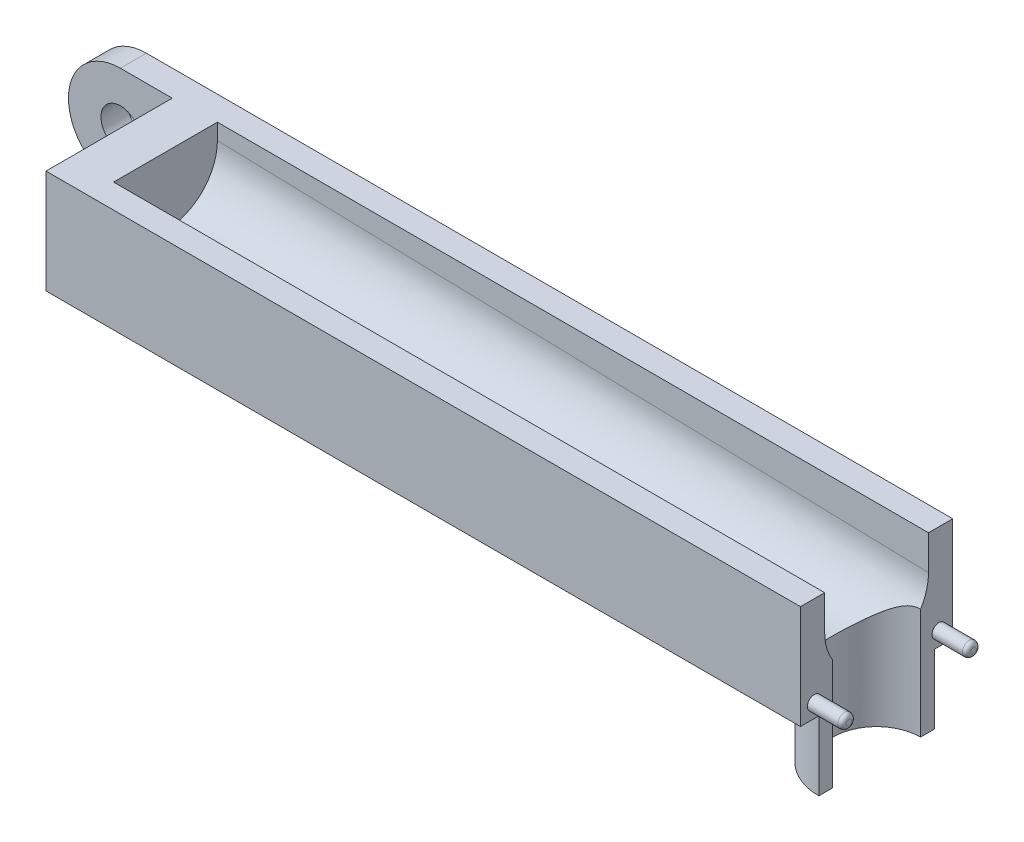
ISO-10303-21;
HEADER;
FILE_DESCRIPTION(('STEP AP214'),'2;1');
FILE_NAME('part.step','',(''),(''),'','','');
FILE_SCHEMA(('AUTOMOTIVE_DESIGN { 1 0 10303 214 1 1 1 1 }'));
ENDSEC;
DATA;
#1=APPLICATION_CONTEXT('core data for automotive mechanical design processes');
#2=APPLICATION_PROTOCOL_DEFINITION('international standard','automotive_design',2000,#1);
#3=PRODUCT_CONTEXT('',#1,'mechanical');
#4=PRODUCT('Part','Part','',(#3));
#5=PRODUCT_RELATED_PRODUCT_CATEGORY('part','',(#4));
#6=PRODUCT_DEFINITION_FORMATION('','',#4);
#7=PRODUCT_DEFINITION_CONTEXT('part definition',#1,'design');
#8=PRODUCT_DEFINITION('design','',#6,#7);
#9=PRODUCT_DEFINITION_SHAPE('','',#8);
#10=(LENGTH_UNIT() NAMED_UNIT(*) SI_UNIT(.MILLI.,.METRE.));
#11=(NAMED_UNIT(*) PLANE_ANGLE_UNIT() SI_UNIT($,.RADIAN.));
#12=(NAMED_UNIT(*) SI_UNIT($,.STERADIAN.) SOLID_ANGLE_UNIT());
#13=UNCERTAINTY_MEASURE_WITH_UNIT(LENGTH_MEASURE(1.E-05),#10,'distance_accuracy_value','');
#14=(GEOMETRIC_REPRESENTATION_CONTEXT(3) GLOBAL_UNCERTAINTY_ASSIGNED_CONTEXT((#13)) GLOBAL_UNIT_ASSIGNED_CONTEXT((#10,
#11,#12)) REPRESENTATION_CONTEXT('',''));
#15=CARTESIAN_POINT('',(0.,0.,0.));
#16=DIRECTION('',(0.,0.,1.));
#17=DIRECTION('',(1.,0.,0.));
#18=AXIS2_PLACEMENT_3D('',#15,#16,#17);
#19=CARTESIAN_POINT('',(138.4173,-22.225,0.));
#20=DIRECTION('',(0.,-1.,0.));
#21=DIRECTION('',(0.,0.,-1.));
#22=AXIS2_PLACEMENT_3D('',#19,#20,#21);
#23=PLANE('',#22);
#24=CARTESIAN_POINT('',(138.4173,-22.225,0.));
#25=DIRECTION('',(0.,-1.,0.));
#26=DIRECTION('',(0.,0.,-1.));
#27=AXIS2_PLACEMENT_3D('',#24,#25,#26);
#28=CIRCLE('',#27,10.6045);
#29=CARTESIAN_POINT('',(138.4173,-22.225,10.6045));
#30=VERTEX_POINT('',#29);
#31=CARTESIAN_POINT('',(138.4173,-22.225,-10.6045));
#32=VERTEX_POINT('',#31);
#33=EDGE_CURVE('E143',#30,#32,#28,.T.);
#34=ORIENTED_EDGE('',*,*,#33,.T.);
#35=DIRECTION('',(0.,0.,-1.));
#36=VECTOR('',#35,1.);
#37=CARTESIAN_POINT('',(138.4173,-22.225,13.97));
#38=LINE('',#37,#36);
#39=CARTESIAN_POINT('',(138.4173,-22.225,-8.0645));
#40=VERTEX_POINT('',#39);
#41=EDGE_CURVE('E530',#40,#32,#38,.T.);
#42=ORIENTED_EDGE('',*,*,#41,.F.);
#43=CARTESIAN_POINT('',(138.4173,-22.225,0.));
#44=DIRECTION('',(0.,-1.,0.));
#45=DIRECTION('',(0.,0.,-1.));
#46=AXIS2_PLACEMENT_3D('',#43,#44,#45);
#47=CIRCLE('',#46,8.0645);
#48=CARTESIAN_POINT('',(138.4173,-22.225,8.0645));
#49=VERTEX_POINT('',#48);
#50=EDGE_CURVE('E531',#49,#40,#47,.T.);
#51=ORIENTED_EDGE('',*,*,#50,.F.);
#52=EDGE_CURVE('E148',#30,#49,#38,.T.);
#53=ORIENTED_EDGE('',*,*,#52,.F.);
#54=EDGE_LOOP('',(#34,#42,#51,#53));
#55=FACE_BOUND('',#54,.T.);
#56=ADVANCED_FACE('F33',(#55),#23,.T.);
#57=CARTESIAN_POINT('',(138.4173,-22.225,0.));
#58=DIRECTION('',(0.,1.,0.));
#59=DIRECTION('',(0.,0.,1.));
#60=AXIS2_PLACEMENT_3D('',#57,#58,#59);
#61=CYLINDRICAL_SURFACE('',#60,10.6045);
#62=DIRECTION('',(0.,1.,0.));
#63=VECTOR('',#62,1.);
#64=CARTESIAN_POINT('',(138.4173,-22.225,-10.6045));
#65=LINE('',#64,#63);
#66=CARTESIAN_POINT('',(138.4173,-9.525,-10.6045));
#67=VERTEX_POINT('',#66);
#68=EDGE_CURVE('E147',#32,#67,#65,.T.);
#69=ORIENTED_EDGE('',*,*,#68,.F.);
#70=ORIENTED_EDGE('',*,*,#33,.F.);
#71=DIRECTION('',(0.,1.,0.));
#72=VECTOR('',#71,1.);
#73=CARTESIAN_POINT('',(138.4173,-22.225,10.6045));
#74=LINE('',#73,#72);
#75=CARTESIAN_POINT('',(138.4173,-9.525,10.6045));
#76=VERTEX_POINT('',#75);
#77=EDGE_CURVE('E136',#76,#30,#74,.F.);
#78=ORIENTED_EDGE('',*,*,#77,.F.);
#79=CARTESIAN_POINT('',(138.4173,-9.525,0.));
#80=DIRECTION('',(0.,1.,0.));
#81=DIRECTION('',(0.,0.,1.));
#82=AXIS2_PLACEMENT_3D('',#79,#80,#81);
#83=CIRCLE('',#82,10.6045);
#84=EDGE_CURVE('E140',#76,#67,#83,.F.);
#85=ORIENTED_EDGE('',*,*,#84,.T.);
#86=EDGE_LOOP('',(#69,#70,#78,#85));
#87=FACE_BOUND('',#86,.T.);
#88=ADVANCED_FACE('F139',(#87),#61,.T.);
#89=CARTESIAN_POINT('',(138.4173,-22.225,0.));
#90=DIRECTION('',(0.,1.,0.));
#91=DIRECTION('',(0.,0.,1.));
#92=AXIS2_PLACEMENT_3D('',#89,#90,#91);
#93=CYLINDRICAL_SURFACE('',#92,8.0645);
#94=ORIENTED_EDGE('',*,*,#50,.T.);
#95=DIRECTION('',(0.,-1.,0.));
#96=VECTOR('',#95,1.);
#97=CARTESIAN_POINT('',(138.4173,9.52500000000009,-8.0645));
#98=LINE('',#97,#96);
#99=CARTESIAN_POINT('',(138.4173,-1.893477557413,-8.0645));
#100=VERTEX_POINT('',#99);
#101=EDGE_CURVE('E528',#100,#40,#98,.T.);
#102=ORIENTED_EDGE('',*,*,#101,.F.);
#103=CARTESIAN_POINT('',(138.4173,-1.893477557413,-8.0645));
#104=CARTESIAN_POINT('',(138.348261490488,-1.89166509618479,-8.06450122168329));
#105=CARTESIAN_POINT('',(138.279196595506,-1.89127251769599,-8.06361317446126));
#106=CARTESIAN_POINT('',(138.141162024241,-1.89329565352478,-8.06006646387264));
#107=CARTESIAN_POINT('',(138.072192336974,-1.89571101096955,-8.05740802553111));
#108=CARTESIAN_POINT('',(137.865913059656,-1.90710555009781,-8.0468036435229));
#109=CARTESIAN_POINT('',(137.728939948282,-1.92022582089757,-8.03622855618554));
#110=CARTESIAN_POINT('',(137.459177777007,-1.95645794545555,-8.00851328840444));
#111=CARTESIAN_POINT('',(137.32635676714,-1.97941541652284,-7.99147499555421));
#112=CARTESIAN_POINT('',(137.063465765685,-2.03416363113122,-7.95116293380551));
#113=CARTESIAN_POINT('',(136.933397285699,-2.06595909935292,-7.92788582995689));
#114=CARTESIAN_POINT('',(136.626022893416,-2.15108622448129,-7.86516632289012));
#115=CARTESIAN_POINT('',(136.450263093756,-2.2079694724281,-7.82296691720035));
#116=CARTESIAN_POINT('',(136.105692865908,-2.33292870638938,-7.72816957525117));
#117=CARTESIAN_POINT('',(135.936885373241,-2.40100936098795,-7.67556729981786));
#118=CARTESIAN_POINT('',(135.604907729987,-2.54593743104196,-7.56027327808437));
#119=CARTESIAN_POINT('',(135.441793740416,-2.62285086131409,-7.49750389598407));
#120=CARTESIAN_POINT('',(135.12242610643,-2.78249733398254,-7.36274420877662));
#121=CARTESIAN_POINT('',(134.966172316025,-2.86523025243831,-7.2907541000211));
#122=CARTESIAN_POINT('',(134.584323283596,-3.07650217578338,-7.0999959261609));
#123=CARTESIAN_POINT('',(134.362766898589,-3.20741106738572,-6.97573420703643));
#124=CARTESIAN_POINT('',(133.933660185702,-3.47262194048077,-6.70798766444703));
#125=CARTESIAN_POINT('',(133.726116392696,-3.60692546550414,-6.56449396386022));
#126=CARTESIAN_POINT('',(133.325490062638,-3.87465214318861,-6.25883160393269));
#127=CARTESIAN_POINT('',(133.132379361802,-4.00807652117544,-6.09670096938882));
#128=CARTESIAN_POINT('',(132.760800457386,-4.27092552604784,-5.75361402433204));
#129=CARTESIAN_POINT('',(132.58232689971,-4.40035160456889,-5.57266465292213));
#130=CARTESIAN_POINT('',(132.273968015489,-4.62793211377197,-5.22859780206963));
#131=CARTESIAN_POINT('',(132.141339635497,-4.72731340914288,-5.0687442755236));
#132=CARTESIAN_POINT('',(131.887250228059,-4.91988610027664,-4.73690437159381));
#133=CARTESIAN_POINT('',(131.765787033657,-5.01307869617194,-4.56492036001078));
#134=CARTESIAN_POINT('',(131.535214878537,-5.19158642366717,-4.20926700130387));
#135=CARTESIAN_POINT('',(131.426093123044,-5.27690969639455,-4.02561007032792));
#136=CARTESIAN_POINT('',(131.221333341849,-5.43814973997114,-3.64698714927302));
#137=CARTESIAN_POINT('',(131.125692758164,-5.51406829498509,-3.4520233145569));
#138=CARTESIAN_POINT('',(130.964862601421,-5.64243125130164,-3.08703460838471));
#139=CARTESIAN_POINT('',(130.897278275298,-5.69665337438041,-2.91868726705674));
#140=CARTESIAN_POINT('',(130.772983200507,-5.79673201350475,-2.57562598660811));
#141=CARTESIAN_POINT('',(130.716270226371,-5.84259024162485,-2.40091335925491));
#142=CARTESIAN_POINT('',(130.614491170541,-5.92511149714523,-2.04606646711942));
#143=CARTESIAN_POINT('',(130.569420809245,-5.96177790313741,-1.86593422174664));
#144=CARTESIAN_POINT('',(130.491582694961,-6.02522141376103,-1.50130419983232));
#145=CARTESIAN_POINT('',(130.458815087334,-6.05199840154719,-1.31680637173804));
#146=CARTESIAN_POINT('',(130.406009733957,-6.09519772885091,-0.943928558818516));
#147=CARTESIAN_POINT('',(130.386030089257,-6.11157280564797,-0.755534814275804));
#148=CARTESIAN_POINT('',(130.359392987414,-6.13341220472642,-0.377172972319024));
#149=CARTESIAN_POINT('',(130.352735558872,-6.13887650358291,-0.187204871525768));
#150=CARTESIAN_POINT('',(130.352865381074,-6.13876999621962,0.192711301271527));
#151=CARTESIAN_POINT('',(130.359651829911,-6.13319984818903,0.382659373794362));
#152=CARTESIAN_POINT('',(130.386543380214,-6.11115210426788,0.760963080205654));
#153=CARTESIAN_POINT('',(130.40664794813,-6.09467494533483,0.949318777581825));
#154=CARTESIAN_POINT('',(130.457892687727,-6.05275364057798,1.30944831815795));
#155=CARTESIAN_POINT('',(130.488131469125,-6.02804265568402,1.48143764186625));
#156=CARTESIAN_POINT('',(130.559335576371,-5.96999125695433,1.82175385735741));
#157=CARTESIAN_POINT('',(130.600304548019,-5.93664791014314,1.99007948323005));
#158=CARTESIAN_POINT('',(130.692404127251,-5.86191819984588,2.32202615685273));
#159=CARTESIAN_POINT('',(130.743531446832,-5.82053443893766,2.48564870730684));
#160=CARTESIAN_POINT('',(130.855361887216,-5.73035745355051,2.80754346738453));
#161=CARTESIAN_POINT('',(130.916068572507,-5.68156147123286,2.96581365866535));
#162=CARTESIAN_POINT('',(131.05137388664,-5.57330025208726,3.28817954802761));
#163=CARTESIAN_POINT('',(131.126678273876,-5.51330557056704,3.45180141516908));
#164=CARTESIAN_POINT('',(131.286841800602,-5.38647011030597,3.7715700142372));
#165=CARTESIAN_POINT('',(131.371704732337,-5.31962661533156,3.92771374403385));
#166=CARTESIAN_POINT('',(131.639575365112,-5.11013483865318,4.38441817598845));
#167=CARTESIAN_POINT('',(131.835872026216,-4.95851950575256,4.6732688246686));
#168=CARTESIAN_POINT('',(132.201975608306,-4.68162613209482,5.14488364737323));
#169=CARTESIAN_POINT('',(132.364886989127,-4.56010676458918,5.33539669109072));
#170=CARTESIAN_POINT('',(132.705526988799,-4.31096889517377,5.69857667349938));
#171=CARTESIAN_POINT('',(132.883262190731,-4.1833476943639,5.87123560633565));
#172=CARTESIAN_POINT('',(133.252797351224,-3.92477198644624,6.19880471589004));
#173=CARTESIAN_POINT('',(133.444621334858,-3.79381204632814,6.3536833634987));
#174=CARTESIAN_POINT('',(133.841593382331,-3.5320126679356,6.64527734464367));
#175=CARTESIAN_POINT('',(134.04673682759,-3.4011732036779,6.78199892466878));
#176=CARTESIAN_POINT('',(134.41625779171,-3.17646562337186,7.00440307457374));
#177=CARTESIAN_POINT('',(134.577633805191,-3.08170440901505,7.09419342111636));
#178=CARTESIAN_POINT('',(134.908134913249,-2.89637005243713,7.26335928802849));
#179=CARTESIAN_POINT('',(135.077260711223,-2.80579729187899,7.34273386049143));
#180=CARTESIAN_POINT('',(135.423204055421,-2.63154330594256,7.49045096194537));
#181=CARTESIAN_POINT('',(135.600004467886,-2.54784782564135,7.55881660749617));
#182=CARTESIAN_POINT('',(135.961896226059,-2.39033290404474,7.6839942574546));
#183=CARTESIAN_POINT('',(136.146982982171,-2.31650808380714,7.74081256334983));
#184=CARTESIAN_POINT('',(136.462243431721,-2.20502345304227,7.82501973818367));
#185=CARTESIAN_POINT('',(136.590127439358,-2.16351690158071,7.85590170918726));
#186=CARTESIAN_POINT('',(136.849340267443,-2.08798451641423,7.91171439852365));
#187=CARTESIAN_POINT('',(136.980667770462,-2.05395586719925,7.93664735702748));
#188=CARTESIAN_POINT('',(137.245946218365,-1.99481662107536,7.98010639963252));
#189=CARTESIAN_POINT('',(137.379887892735,-1.96967902030762,7.99865187918271));
#190=CARTESIAN_POINT('',(137.649971359256,-1.9294182406905,8.02906011789665));
#191=CARTESIAN_POINT('',(137.786111653927,-1.91428851763418,8.0409272433141));
#192=CARTESIAN_POINT('',(138.004952138709,-1.89876764558756,8.05437190776033));
#193=CARTESIAN_POINT('',(138.08728657725,-1.89490376525848,8.05816595054862));
#194=CARTESIAN_POINT('',(138.252193683452,-1.8911705548865,8.06323279365226));
#195=CARTESIAN_POINT('',(138.334766495048,-1.891304661052,8.06450342413288));
#196=CARTESIAN_POINT('',(138.4173,-1.89347755741299,8.0645));
#197=B_SPLINE_CURVE_WITH_KNOTS('',3,(#103,#104,#105,#106,#107,#108,#109,#110,#111,#112,#113,
#114,#115,#116,#117,#118,#119,#120,#121,#122,#123,#124,#125,#126,#127,#128,#129,#130,#131,#132,
#133,#134,#135,#136,#137,#138,#139,#140,#141,#142,#143,#144,#145,#146,#147,#148,#149,#150,#151,
#152,#153,#154,#155,#156,#157,#158,#159,#160,#161,#162,#163,#164,#165,#166,#167,#168,#169,#170,
#171,#172,#173,#174,#175,#176,#177,#178,#179,#180,#181,#182,#183,#184,#185,#186,#187,#188,#189,
#190,#191,#192,#193,#194,#195,#196),.UNSPECIFIED.,.F.,.F.,(4,2,2,2,2,2,2,2,2,2,2,2,2,2,2,2,2,2,
2,2,2,2,2,2,2,2,2,2,2,2,2,2,2,2,2,2,2,2,2,2,2,2,2,2,2,2,4),(0.,0.207145597104745,
0.414264870049337,0.827626898952442,1.23472654039575,1.6420442320615,2.20959669323147,
2.77738638921491,3.34973600096062,3.92207342677992,4.77823197408041,5.63478707792631,
6.48962458160509,7.34414798798741,8.03431936533694,8.72435650922381,9.41367158114747,
10.1028556825049,10.6703094014833,11.2376468329997,11.804775424375,12.371910716264,
12.9416047843827,13.5113000756056,14.0809613863306,14.6505998766212,15.1791179142763,
15.7078157601312,16.2363427575979,16.7650668860718,17.3340435941869,17.9032468379116,
19.0415966815331,19.8763778740696,20.7115317773138,21.5481444703431,22.3844685977917,
23.0067809436093,23.6291498848802,24.2501944361117,24.8708991622746,25.2844411517819,
25.6978271705231,26.1099466499332,26.5217963750139,26.769208586411,27.0168334509554),.UNSPECIFIED.);
#198=CARTESIAN_POINT('',(138.4173,-1.89347755741299,8.0645));
#199=VERTEX_POINT('',#198);
#200=EDGE_CURVE('E269',#100,#199,#197,.T.);
#201=ORIENTED_EDGE('',*,*,#200,.T.);
#202=DIRECTION('',(0.,-1.,0.));
#203=VECTOR('',#202,1.);
#204=CARTESIAN_POINT('',(138.4173,9.52500000000009,8.0645));
#205=LINE('',#204,#203);
#206=EDGE_CURVE('E48',#49,#199,#205,.F.);
#207=ORIENTED_EDGE('',*,*,#206,.F.);
#208=EDGE_LOOP('',(#94,#102,#201,#207));
#209=FACE_BOUND('',#208,.T.);
#210=ADVANCED_FACE('F217',(#209),#93,.F.);
#211=CARTESIAN_POINT('',(138.4173,0.,0.));
#212=DIRECTION('',(-1.,0.,0.));
#213=DIRECTION('',(0.,0.,1.));
#214=AXIS2_PLACEMENT_3D('',#211,#212,#213);
#215=PLANE('',#214);
#216=CARTESIAN_POINT('',(138.4173,-6.985,-11.43));
#217=DIRECTION('',(-1.,0.,0.));
#218=DIRECTION('',(0.,0.,1.));
#219=AXIS2_PLACEMENT_3D('',#216,#217,#218);
#220=CIRCLE('',#219,1.27);
#221=CARTESIAN_POINT('',(138.4173,-6.985,-10.16));
#222=VERTEX_POINT('',#221);
#223=EDGE_CURVE('E189',#222,#222,#220,.F.);
#224=ORIENTED_EDGE('',*,*,#223,.F.);
#225=EDGE_LOOP('',(#224));
#226=FACE_BOUND('',#225,.T.);
#227=CARTESIAN_POINT('',(138.4173,3.17500000000009,-9.525));
#228=CARTESIAN_POINT('',(138.4173,2.90710636951569,-9.52502880308579));
#229=CARTESIAN_POINT('',(138.4173,2.63921688214058,-9.5136993193376));
#230=CARTESIAN_POINT('',(138.4173,2.10535446999233,-9.46853181588204));
#231=CARTESIAN_POINT('',(138.4173,1.83938145406681,-9.43469487392717));
#232=CARTESIAN_POINT('',(138.4173,1.31141986681751,-9.34475207723556));
#233=CARTESIAN_POINT('',(138.4173,1.04942862616524,-9.28866189247582));
#234=CARTESIAN_POINT('',(138.4173,0.531103084706367,-9.15462068517997));
#235=CARTESIAN_POINT('',(138.4173,0.274768715199605,-9.07666992828848));
#236=CARTESIAN_POINT('',(138.4173,-0.230541539428631,-8.89941777473788));
#237=CARTESIAN_POINT('',(138.4173,-0.479513981745249,-8.80010656301914));
#238=CARTESIAN_POINT('',(138.4173,-0.96821199674888,-8.58085916286381));
#239=CARTESIAN_POINT('',(138.4173,-1.20793737117213,-8.46092253250404));
#240=CARTESIAN_POINT('',(138.4173,-1.67638284749587,-8.2013051127429));
#241=CARTESIAN_POINT('',(138.4173,-1.90510519690559,-8.06162837866167));
#242=CARTESIAN_POINT('',(138.4173,-2.34997044894806,-7.7635057612349));
#243=CARTESIAN_POINT('',(138.4173,-2.56611340884637,-7.6050599633423));
#244=CARTESIAN_POINT('',(138.4173,-2.98429198445746,-7.27051906656807));
#245=CARTESIAN_POINT('',(138.4173,-3.18632710630337,-7.09442335034852));
#246=CARTESIAN_POINT('',(138.4173,-3.57484139426011,-6.72584294773196));
#247=CARTESIAN_POINT('',(138.4173,-3.76132089085019,-6.53335860968686));
#248=CARTESIAN_POINT('',(138.4173,-4.11743232508971,-6.13333322053391));
#249=CARTESIAN_POINT('',(138.4173,-4.2870615046551,-5.9257897141086));
#250=CARTESIAN_POINT('',(138.4173,-4.60823143453897,-5.49714962732861));
#251=CARTESIAN_POINT('',(138.4173,-4.75977219291506,-5.27605305301128));
#252=CARTESIAN_POINT('',(138.4173,-5.04368159450875,-4.82188885302562));
#253=CARTESIAN_POINT('',(138.4173,-5.17605108156056,-4.58882175485864));
#254=CARTESIAN_POINT('',(138.4173,-5.42068476516995,-4.11236460914558));
#255=CARTESIAN_POINT('',(138.4173,-5.53294896060468,-3.86897456102299));
#256=CARTESIAN_POINT('',(138.4173,-5.7365673365378,-3.37361789299633));
#257=CARTESIAN_POINT('',(138.4173,-5.82792285664935,-3.12165182374448));
#258=CARTESIAN_POINT('',(138.4173,-5.98908364968767,-2.61091955380518));
#259=CARTESIAN_POINT('',(138.4173,-6.05888892412982,-2.3521533535959));
#260=CARTESIAN_POINT('',(138.4173,-6.17645419778953,-1.82965499214984));
#261=CARTESIAN_POINT('',(138.4173,-6.22421374425433,-1.56592272904088));
#262=CARTESIAN_POINT('',(138.4173,-6.29734591601616,-1.03537233089459));
#263=CARTESIAN_POINT('',(138.4173,-6.32271854007901,-0.76855419568715));
#264=CARTESIAN_POINT('',(138.4173,-6.3508968068655,-0.233722777773009));
#265=CARTESIAN_POINT('',(138.4173,-6.35370193022794,0.0342905322970394));
#266=CARTESIAN_POINT('',(138.4173,-6.33672388793071,0.569600735391586));
#267=CARTESIAN_POINT('',(138.4173,-6.31694072225219,0.836897628415487));
#268=CARTESIAN_POINT('',(138.4173,-6.25492706052983,1.36887199031537));
#269=CARTESIAN_POINT('',(138.4173,-6.21269678737656,1.63354948517432));
#270=CARTESIAN_POINT('',(138.4173,-6.10608928151298,2.15840604120375));
#271=CARTESIAN_POINT('',(138.4173,-6.04171204891415,2.41858510239688));
#272=CARTESIAN_POINT('',(138.4173,-5.89126854645122,2.93259425821957));
#273=CARTESIAN_POINT('',(138.4173,-5.80520234490116,3.18642437284373));
#274=CARTESIAN_POINT('',(138.4173,-5.61199268640836,3.68593189843645));
#275=CARTESIAN_POINT('',(138.4173,-5.50484923055732,3.93160930982728));
#276=CARTESIAN_POINT('',(138.4173,-5.27024493227508,4.41306862968216));
#277=CARTESIAN_POINT('',(138.4173,-5.14278376923979,4.64885038192307));
#278=CARTESIAN_POINT('',(138.4173,-4.86844857714667,5.10884279359658));
#279=CARTESIAN_POINT('',(138.4173,-4.72157414041553,5.33305320989682));
#280=CARTESIAN_POINT('',(138.4173,-4.40946793786088,5.76829068041108));
#281=CARTESIAN_POINT('',(138.4173,-4.24423725362736,5.97931851022826));
#282=CARTESIAN_POINT('',(138.4173,-3.89658647370972,6.3867046056825));
#283=CARTESIAN_POINT('',(138.4173,-3.71416641049008,6.58306289902373));
#284=CARTESIAN_POINT('',(138.4173,-3.33345892458108,6.95968923569139));
#285=CARTESIAN_POINT('',(138.4173,-3.13517362651337,7.13995942666822));
#286=CARTESIAN_POINT('',(138.4173,-2.72412365795625,7.48315788187575));
#287=CARTESIAN_POINT('',(138.4173,-2.51135898460188,7.64608614267509));
#288=CARTESIAN_POINT('',(138.4173,-2.07278924351203,7.95349406108793));
#289=CARTESIAN_POINT('',(138.4173,-1.8469798491703,8.09796754610229));
#290=CARTESIAN_POINT('',(138.4173,-1.38399811433214,8.36737063028996));
#291=CARTESIAN_POINT('',(138.4173,-1.14682612033463,8.49230082493489));
#292=CARTESIAN_POINT('',(138.4173,-0.662645561547024,8.72180739776883));
#293=CARTESIAN_POINT('',(138.4173,-0.415630821013257,8.82637074679174));
#294=CARTESIAN_POINT('',(138.4173,0.0863298593561496,9.01429736468387));
#295=CARTESIAN_POINT('',(138.4173,0.341275584258725,9.09766120750801));
#296=CARTESIAN_POINT('',(138.4173,0.856950944211646,9.24250591805611));
#297=CARTESIAN_POINT('',(138.4173,1.11767278306814,9.30401457551381));
#298=CARTESIAN_POINT('',(138.4173,1.64326629049545,9.40483738558105));
#299=CARTESIAN_POINT('',(138.4173,1.90813585620842,9.44416243310338));
#300=CARTESIAN_POINT('',(138.4173,2.34048489351578,9.48984743799971));
#301=CARTESIAN_POINT('',(138.4173,2.50727229378025,9.50303805093001));
#302=CARTESIAN_POINT('',(138.4173,2.84103400798305,9.52060801901113));
#303=CARTESIAN_POINT('',(138.4173,3.00800755710718,9.52500190448859));
#304=CARTESIAN_POINT('',(138.4173,3.17500000000009,9.525));
#305=B_SPLINE_CURVE_WITH_KNOTS('',3,(#227,#228,#229,#230,#231,#232,#233,#234,#235,#236,#237,
#238,#239,#240,#241,#242,#243,#244,#245,#246,#247,#248,#249,#250,#251,#252,#253,#254,#255,#256,
#257,#258,#259,#260,#261,#262,#263,#264,#265,#266,#267,#268,#269,#270,#271,#272,#273,#274,#275,
#276,#277,#278,#279,#280,#281,#282,#283,#284,#285,#286,#287,#288,#289,#290,#291,#292,#293,#294,
#295,#296,#297,#298,#299,#300,#301,#302,#303,#304),.UNSPECIFIED.,.F.,.F.,(4,2,2,2,2,2,2,2,2,2,2,
2,2,2,2,2,2,2,2,2,2,2,2,2,2,2,2,2,2,2,2,2,2,2,2,2,2,2,4),(0.,0.803435583558495,1.60683269798474,
2.40966508872313,3.21248772404982,4.01568004487274,4.81888957715372,5.62193434081106,
6.42497544845702,7.22804465373076,8.03109679345124,8.83428016205537,9.63746317287526,
10.4406108203955,11.2437585127696,12.0468547332747,12.8499508973074,13.6530635537795,
14.4561762545271,15.2593074377996,16.062438621742,16.8655618310701,17.6686850363557,
18.4718057120653,19.2749263461771,20.0780596544184,20.881209830915,21.684312709132,
22.4874140706102,23.2904080627445,24.0934022137632,24.8966642441936,25.6999017949724,
26.5036515207281,27.307379483466,28.1100817859002,28.9123895176335,29.414100884836,
29.9149828453434),.UNSPECIFIED.);
#306=CARTESIAN_POINT('',(138.4173,3.17500000000009,-9.525));
#307=VERTEX_POINT('',#306);
#308=EDGE_CURVE('E241',#307,#100,#305,.T.);
#309=ORIENTED_EDGE('',*,*,#308,.T.);
#310=ORIENTED_EDGE('',*,*,#101,.T.);
#311=ORIENTED_EDGE('',*,*,#41,.T.);
#312=ORIENTED_EDGE('',*,*,#68,.T.);
#313=DIRECTION('',(0.,0.,-1.));
#314=VECTOR('',#313,1.);
#315=CARTESIAN_POINT('',(138.4173,-9.525,13.97));
#316=LINE('',#315,#314);
#317=CARTESIAN_POINT('',(138.4173,-9.525,-13.97));
#318=VERTEX_POINT('',#317);
#319=EDGE_CURVE('E156',#67,#318,#316,.T.);
#320=ORIENTED_EDGE('',*,*,#319,.T.);
#321=DIRECTION('',(0.,1.,0.));
#322=VECTOR('',#321,1.);
#323=CARTESIAN_POINT('',(138.4173,-9.525,-13.97));
#324=LINE('',#323,#322);
#325=CARTESIAN_POINT('',(138.4173,9.525,-13.97));
#326=VERTEX_POINT('',#325);
#327=EDGE_CURVE('E178',#318,#326,#324,.T.);
#328=ORIENTED_EDGE('',*,*,#327,.T.);
#329=DIRECTION('',(0.,0.,1.));
#330=VECTOR('',#329,1.);
#331=CARTESIAN_POINT('',(138.4173,9.525,13.97));
#332=LINE('',#331,#330);
#333=CARTESIAN_POINT('',(138.4173,9.52500000000009,-9.525));
#334=VERTEX_POINT('',#333);
#335=EDGE_CURVE('E501',#326,#334,#332,.T.);
#336=ORIENTED_EDGE('',*,*,#335,.T.);
#337=DIRECTION('',(0.,-1.,0.));
#338=VECTOR('',#337,1.);
#339=CARTESIAN_POINT('',(138.4173,9.49083598752051,-9.525));
#340=LINE('',#339,#338);
#341=EDGE_CURVE('E505',#334,#307,#340,.T.);
#342=ORIENTED_EDGE('',*,*,#341,.T.);
#343=EDGE_LOOP('',(#309,#310,#311,#312,#320,#328,#336,#342));
#344=FACE_BOUND('',#343,.T.);
#345=ADVANCED_FACE('F335',(#226,#344),#215,.F.);
#346=CARTESIAN_POINT('',(0.,0.,0.));
#347=DIRECTION('',(-1.,0.,0.));
#348=DIRECTION('',(0.,0.,1.));
#349=AXIS2_PLACEMENT_3D('',#346,#347,#348);
#350=PLANE('',#349);
#351=DIRECTION('',(0.,0.,1.));
#352=VECTOR('',#351,1.);
#353=CARTESIAN_POINT('',(0.,9.525,13.97));
#354=LINE('',#353,#352);
#355=CARTESIAN_POINT('',(0.,9.525,-9.1948));
#356=VERTEX_POINT('',#355);
#357=CARTESIAN_POINT('',(0.,9.525,13.97));
#358=VERTEX_POINT('',#357);
#359=EDGE_CURVE('E171',#356,#358,#354,.T.);
#360=ORIENTED_EDGE('',*,*,#359,.F.);
#361=DIRECTION('',(0.,-1.,0.));
#362=VECTOR('',#361,1.);
#363=CARTESIAN_POINT('',(0.,-9.525,-9.1948));
#364=LINE('',#363,#362);
#365=CARTESIAN_POINT('',(0.,-9.525,-9.1948));
#366=VERTEX_POINT('',#365);
#367=EDGE_CURVE('E470',#356,#366,#364,.T.);
#368=ORIENTED_EDGE('',*,*,#367,.T.);
#369=DIRECTION('',(0.,0.,-1.));
#370=VECTOR('',#369,1.);
#371=CARTESIAN_POINT('',(0.,-9.525,13.97));
#372=LINE('',#371,#370);
#373=CARTESIAN_POINT('',(0.,-9.525,13.97));
#374=VERTEX_POINT('',#373);
#375=EDGE_CURVE('E176',#374,#366,#372,.T.);
#376=ORIENTED_EDGE('',*,*,#375,.F.);
#377=DIRECTION('',(0.,-1.,0.));
#378=VECTOR('',#377,1.);
#379=CARTESIAN_POINT('',(0.,-9.525,13.97));
#380=LINE('',#379,#378);
#381=EDGE_CURVE('E173',#358,#374,#380,.T.);
#382=ORIENTED_EDGE('',*,*,#381,.F.);
#383=EDGE_LOOP('',(#360,#368,#376,#382));
#384=FACE_BOUND('',#383,.T.);
#385=ADVANCED_FACE('F347',(#384),#350,.T.);
#386=CARTESIAN_POINT('',(138.4173,9.525,13.97));
#387=DIRECTION('',(0.,-1.,0.));
#388=DIRECTION('',(0.,0.,-1.));
#389=AXIS2_PLACEMENT_3D('',#386,#387,#388);
#390=PLANE('',#389);
#391=DIRECTION('',(-1.,0.,0.));
#392=VECTOR('',#391,1.);
#393=CARTESIAN_POINT('',(138.4173,9.525,-9.525));
#394=LINE('',#393,#392);
#395=CARTESIAN_POINT('',(7.95019999999999,9.525,-9.525));
#396=VERTEX_POINT('',#395);
#397=EDGE_CURVE('E174',#334,#396,#394,.T.);
#398=ORIENTED_EDGE('',*,*,#397,.F.);
#399=ORIENTED_EDGE('',*,*,#335,.F.);
#400=DIRECTION('',(-1.,0.,0.));
#401=VECTOR('',#400,1.);
#402=CARTESIAN_POINT('',(138.4173,9.525,-13.97));
#403=LINE('',#402,#401);
#404=CARTESIAN_POINT('',(-9.525,9.525,-13.97));
#405=VERTEX_POINT('',#404);
#406=EDGE_CURVE('E184',#326,#405,#403,.T.);
#407=ORIENTED_EDGE('',*,*,#406,.T.);
#408=DIRECTION('',(0.,0.,-1.));
#409=VECTOR('',#408,1.);
#410=CARTESIAN_POINT('',(-9.525,9.525,-9.1948));
#411=LINE('',#410,#409);
#412=CARTESIAN_POINT('',(-9.525,9.525,-9.1948));
#413=VERTEX_POINT('',#412);
#414=EDGE_CURVE('E485',#413,#405,#411,.T.);
#415=ORIENTED_EDGE('',*,*,#414,.F.);
#416=DIRECTION('',(1.,0.,0.));
#417=VECTOR('',#416,1.);
#418=CARTESIAN_POINT('',(0.,9.525,-9.1948));
#419=LINE('',#418,#417);
#420=EDGE_CURVE('E473',#413,#356,#419,.T.);
#421=ORIENTED_EDGE('',*,*,#420,.T.);
#422=ORIENTED_EDGE('',*,*,#359,.T.);
#423=DIRECTION('',(-1.,0.,0.));
#424=VECTOR('',#423,1.);
#425=CARTESIAN_POINT('',(138.4173,9.525,13.97));
#426=LINE('',#425,#424);
#427=CARTESIAN_POINT('',(138.4173,9.525,13.97));
#428=VERTEX_POINT('',#427);
#429=EDGE_CURVE('E181',#428,#358,#426,.T.);
#430=ORIENTED_EDGE('',*,*,#429,.F.);
#431=CARTESIAN_POINT('',(138.4173,9.525,9.525));
#432=VERTEX_POINT('',#431);
#433=EDGE_CURVE('E499',#432,#428,#332,.T.);
#434=ORIENTED_EDGE('',*,*,#433,.F.);
#435=DIRECTION('',(1.,0.,0.));
#436=VECTOR('',#435,1.);
#437=CARTESIAN_POINT('',(138.4173,9.525,9.525));
#438=LINE('',#437,#436);
#439=CARTESIAN_POINT('',(7.95019999999999,9.525,9.525));
#440=VERTEX_POINT('',#439);
#441=EDGE_CURVE('E511',#440,#432,#438,.T.);
#442=ORIENTED_EDGE('',*,*,#441,.F.);
#443=DIRECTION('',(0.,0.,1.));
#444=VECTOR('',#443,1.);
#445=CARTESIAN_POINT('',(7.95019999999999,9.525,13.97));
#446=LINE('',#445,#444);
#447=EDGE_CURVE('E158',#396,#440,#446,.T.);
#448=ORIENTED_EDGE('',*,*,#447,.F.);
#449=EDGE_LOOP('',(#398,#399,#407,#415,#421,#422,#430,#434,#442,#448));
#450=FACE_BOUND('',#449,.T.);
#451=ADVANCED_FACE('F332',(#450),#390,.F.);
#452=CARTESIAN_POINT('',(138.4173,-6.985,11.43));
#453=DIRECTION('',(-1.,0.,0.));
#454=DIRECTION('',(0.,0.,1.));
#455=AXIS2_PLACEMENT_3D('',#452,#453,#454);
#456=CIRCLE('',#455,1.27);
#457=CARTESIAN_POINT('',(138.4173,-6.985,12.7));
#458=VERTEX_POINT('',#457);
#459=EDGE_CURVE('E157',#458,#458,#456,.F.);
#460=ORIENTED_EDGE('',*,*,#459,.F.);
#461=EDGE_LOOP('',(#460));
#462=FACE_BOUND('',#461,.T.);
#463=CARTESIAN_POINT('',(138.4173,-9.525,13.97));
#464=VERTEX_POINT('',#463);
#465=EDGE_CURVE('E154',#464,#76,#316,.T.);
#466=ORIENTED_EDGE('',*,*,#465,.T.);
#467=ORIENTED_EDGE('',*,*,#77,.T.);
#468=ORIENTED_EDGE('',*,*,#52,.T.);
#469=ORIENTED_EDGE('',*,*,#206,.T.);
#470=CARTESIAN_POINT('',(138.4173,3.17500000000009,9.525));
#471=VERTEX_POINT('',#470);
#472=EDGE_CURVE('E250',#199,#471,#305,.T.);
#473=ORIENTED_EDGE('',*,*,#472,.T.);
#474=DIRECTION('',(0.,1.,0.));
#475=VECTOR('',#474,1.);
#476=CARTESIAN_POINT('',(138.4173,3.1408359875205,9.525));
#477=LINE('',#476,#475);
#478=EDGE_CURVE('E249',#471,#432,#477,.T.);
#479=ORIENTED_EDGE('',*,*,#478,.T.);
#480=ORIENTED_EDGE('',*,*,#433,.T.);
#481=DIRECTION('',(0.,-1.,0.));
#482=VECTOR('',#481,1.);
#483=CARTESIAN_POINT('',(138.4173,-9.525,13.97));
#484=LINE('',#483,#482);
#485=EDGE_CURVE('E162',#428,#464,#484,.T.);
#486=ORIENTED_EDGE('',*,*,#485,.T.);
#487=EDGE_LOOP('',(#466,#467,#468,#469,#473,#479,#480,#486));
#488=FACE_BOUND('',#487,.T.);
#489=ADVANCED_FACE('F160',(#462,#488),#215,.F.);
#490=CARTESIAN_POINT('',(138.4173,-9.525,-13.97));
#491=DIRECTION('',(0.,0.,1.));
#492=DIRECTION('',(1.,0.,0.));
#493=AXIS2_PLACEMENT_3D('',#490,#491,#492);
#494=PLANE('',#493);
#495=DIRECTION('',(-1.,0.,0.));
#496=VECTOR('',#495,1.);
#497=CARTESIAN_POINT('',(138.4173,-9.525,-13.97));
#498=LINE('',#497,#496);
#499=CARTESIAN_POINT('',(-9.525,-9.525,-13.97));
#500=VERTEX_POINT('',#499);
#501=EDGE_CURVE('E164',#318,#500,#498,.T.);
#502=ORIENTED_EDGE('',*,*,#501,.T.);
#503=CARTESIAN_POINT('',(-9.525,0.,-13.97));
#504=DIRECTION('',(0.,0.,-1.));
#505=DIRECTION('',(-1.,0.,0.));
#506=AXIS2_PLACEMENT_3D('',#503,#504,#505);
#507=CIRCLE('',#506,9.525);
#508=EDGE_CURVE('E477',#500,#405,#507,.T.);
#509=ORIENTED_EDGE('',*,*,#508,.T.);
#510=ORIENTED_EDGE('',*,*,#406,.F.);
#511=ORIENTED_EDGE('',*,*,#327,.F.);
#512=EDGE_LOOP('',(#502,#509,#510,#511));
#513=FACE_BOUND('',#512,.T.);
#514=CARTESIAN_POINT('',(-9.525,0.,-13.97));
#515=DIRECTION('',(0.,0.,-1.));
#516=DIRECTION('',(-1.,0.,0.));
#517=AXIS2_PLACEMENT_3D('',#514,#515,#516);
#518=CIRCLE('',#517,3.556);
#519=CARTESIAN_POINT('',(-13.081,0.,-13.97));
#520=VERTEX_POINT('',#519);
#521=EDGE_CURVE('E535',#520,#520,#518,.T.);
#522=ORIENTED_EDGE('',*,*,#521,.F.);
#523=EDGE_LOOP('',(#522));
#524=FACE_BOUND('',#523,.T.);
#525=ADVANCED_FACE('F331',(#513,#524),#494,.F.);
#526=CARTESIAN_POINT('',(138.4173,-9.525,13.97));
#527=DIRECTION('',(0.,0.,-1.));
#528=DIRECTION('',(-1.,0.,0.));
#529=AXIS2_PLACEMENT_3D('',#526,#527,#528);
#530=PLANE('',#529);
#531=ORIENTED_EDGE('',*,*,#381,.T.);
#532=DIRECTION('',(-1.,0.,0.));
#533=VECTOR('',#532,1.);
#534=CARTESIAN_POINT('',(138.4173,-9.525,13.97));
#535=LINE('',#534,#533);
#536=EDGE_CURVE('E166',#464,#374,#535,.T.);
#537=ORIENTED_EDGE('',*,*,#536,.F.);
#538=ORIENTED_EDGE('',*,*,#485,.F.);
#539=ORIENTED_EDGE('',*,*,#429,.T.);
#540=EDGE_LOOP('',(#531,#537,#538,#539));
#541=FACE_BOUND('',#540,.T.);
#542=ADVANCED_FACE('F377',(#541),#530,.F.);
#543=CARTESIAN_POINT('',(138.4173,-9.525,13.97));
#544=DIRECTION('',(0.,1.,0.));
#545=DIRECTION('',(0.,0.,1.));
#546=AXIS2_PLACEMENT_3D('',#543,#544,#545);
#547=PLANE('',#546);
#548=ORIENTED_EDGE('',*,*,#84,.F.);
#549=ORIENTED_EDGE('',*,*,#465,.F.);
#550=ORIENTED_EDGE('',*,*,#536,.T.);
#551=ORIENTED_EDGE('',*,*,#375,.T.);
#552=DIRECTION('',(-1.,0.,0.));
#553=VECTOR('',#552,1.);
#554=CARTESIAN_POINT('',(-9.525,-9.525,-9.1948));
#555=LINE('',#554,#553);
#556=CARTESIAN_POINT('',(-9.525,-9.525,-9.1948));
#557=VERTEX_POINT('',#556);
#558=EDGE_CURVE('E56',#366,#557,#555,.T.);
#559=ORIENTED_EDGE('',*,*,#558,.T.);
#560=DIRECTION('',(0.,0.,-1.));
#561=VECTOR('',#560,1.);
#562=CARTESIAN_POINT('',(-9.525,-9.525,-9.1948));
#563=LINE('',#562,#561);
#564=EDGE_CURVE('E251',#557,#500,#563,.T.);
#565=ORIENTED_EDGE('',*,*,#564,.T.);
#566=ORIENTED_EDGE('',*,*,#501,.F.);
#567=ORIENTED_EDGE('',*,*,#319,.F.);
#568=EDGE_LOOP('',(#548,#549,#550,#551,#559,#565,#566,#567));
#569=FACE_BOUND('',#568,.T.);
#570=ADVANCED_FACE('F152',(#569),#547,.F.);
#571=CARTESIAN_POINT('',(7.95019999999999,6.59140124795832,0.));
#572=DIRECTION('',(1.,0.,0.));
#573=DIRECTION('',(0.,0.,-1.));
#574=AXIS2_PLACEMENT_3D('',#571,#572,#573);
#575=PLANE('',#574);
#576=ORIENTED_EDGE('',*,*,#447,.T.);
#577=DIRECTION('',(0.,-1.,0.));
#578=VECTOR('',#577,1.);
#579=CARTESIAN_POINT('',(7.95019999999999,6.59140124795832,9.525));
#580=LINE('',#579,#578);
#581=CARTESIAN_POINT('',(7.95019999999998,6.59140124795837,9.525));
#582=VERTEX_POINT('',#581);
#583=EDGE_CURVE('E521',#440,#582,#580,.T.);
#584=ORIENTED_EDGE('',*,*,#583,.T.);
#585=CARTESIAN_POINT('',(7.95019999999999,6.59140124795832,0.));
#586=DIRECTION('',(1.,0.,0.));
#587=DIRECTION('',(0.,0.,-1.));
#588=AXIS2_PLACEMENT_3D('',#585,#586,#587);
#589=CIRCLE('',#588,9.525);
#590=CARTESIAN_POINT('',(7.95019999999998,6.59140124795838,-9.525));
#591=VERTEX_POINT('',#590);
#592=EDGE_CURVE('E519',#582,#591,#589,.T.);
#593=ORIENTED_EDGE('',*,*,#592,.T.);
#594=DIRECTION('',(0.,1.,0.));
#595=VECTOR('',#594,1.);
#596=CARTESIAN_POINT('',(7.95019999999999,12.9414012479583,-9.525));
#597=LINE('',#596,#595);
#598=EDGE_CURVE('E517',#591,#396,#597,.T.);
#599=ORIENTED_EDGE('',*,*,#598,.T.);
#600=EDGE_LOOP('',(#576,#584,#593,#599));
#601=FACE_BOUND('',#600,.T.);
#602=ADVANCED_FACE('F376',(#601),#575,.T.);
#603=CARTESIAN_POINT('',(139.721971,9.49083598752051,-9.525));
#604=DIRECTION('',(0.,0.,1.));
#605=DIRECTION('',(0.,-1.,0.));
#606=AXIS2_PLACEMENT_3D('',#603,#604,#605);
#607=PLANE('',#606);
#608=ORIENTED_EDGE('',*,*,#397,.T.);
#609=ORIENTED_EDGE('',*,*,#598,.F.);
#610=DIRECTION('',(-0.999657324975558,0.0261769483078661,0.));
#611=VECTOR('',#610,1.);
#612=CARTESIAN_POINT('',(139.721971,3.1408359875205,-9.525));
#613=LINE('',#612,#611);
#614=EDGE_CURVE('E490',#307,#591,#613,.T.);
#615=ORIENTED_EDGE('',*,*,#614,.F.);
#616=ORIENTED_EDGE('',*,*,#341,.F.);
#617=EDGE_LOOP('',(#608,#609,#615,#616));
#618=FACE_BOUND('',#617,.T.);
#619=ADVANCED_FACE('F260',(#618),#607,.T.);
#620=CARTESIAN_POINT('',(139.721971,3.1408359875205,9.525));
#621=DIRECTION('',(0.,0.,-1.));
#622=DIRECTION('',(-1.,0.,0.));
#623=AXIS2_PLACEMENT_3D('',#620,#621,#622);
#624=PLANE('',#623);
#625=ORIENTED_EDGE('',*,*,#441,.T.);
#626=ORIENTED_EDGE('',*,*,#478,.F.);
#627=DIRECTION('',(-0.999657324975558,0.0261769483078661,0.));
#628=VECTOR('',#627,1.);
#629=CARTESIAN_POINT('',(139.721971,3.1408359875205,9.525));
#630=LINE('',#629,#628);
#631=EDGE_CURVE('E487',#471,#582,#630,.T.);
#632=ORIENTED_EDGE('',*,*,#631,.T.);
#633=ORIENTED_EDGE('',*,*,#583,.F.);
#634=EDGE_LOOP('',(#625,#626,#632,#633));
#635=FACE_BOUND('',#634,.T.);
#636=ADVANCED_FACE('F238',(#635),#624,.T.);
#637=CARTESIAN_POINT('',(139.721971,3.1408359875205,9.525));
#638=CARTESIAN_POINT('',(7.95019999999999,6.59140124795843,9.525));
#639=CARTESIAN_POINT('',(139.721971,-15.9091640124795,9.525));
#640=CARTESIAN_POINT('',(7.95019999999997,-12.4585987520416,9.525));
#641=CARTESIAN_POINT('',(139.721971,-15.9091640124795,-9.525));
#642=CARTESIAN_POINT('',(7.95019999999997,-12.4585987520416,-9.525));
#643=CARTESIAN_POINT('',(139.721971,3.1408359875205,-9.525));
#644=CARTESIAN_POINT('',(7.95019999999999,6.59140124795843,-9.525));
#645=(BOUNDED_SURFACE() B_SPLINE_SURFACE(3,1,((#637,#638),(#639,#640),(#641,#642),(#643,#644)),
.UNSPECIFIED.,.F.,.F.,.F.) B_SPLINE_SURFACE_WITH_KNOTS((4,4),(2,2),(0.,1.),(0.,1.),
.UNSPECIFIED.) GEOMETRIC_REPRESENTATION_ITEM() RATIONAL_B_SPLINE_SURFACE(((1.,1.),
(0.333333333333333,0.333333333333333),(0.333333333333333,0.333333333333333),(1.,1.))) REPRESENTATION_ITEM('') SURFACE());
#646=ORIENTED_EDGE('',*,*,#200,.F.);
#647=ORIENTED_EDGE('',*,*,#308,.F.);
#648=ORIENTED_EDGE('',*,*,#614,.T.);
#649=ORIENTED_EDGE('',*,*,#592,.F.);
#650=ORIENTED_EDGE('',*,*,#631,.F.);
#651=ORIENTED_EDGE('',*,*,#472,.F.);
#652=EDGE_LOOP('',(#646,#647,#648,#649,#650,#651));
#653=FACE_BOUND('',#652,.T.);
#654=ADVANCED_FACE('F234',(#653),#645,.T.);
#655=CARTESIAN_POINT('',(-9.525,0.,-9.1948));
#656=DIRECTION('',(0.,0.,-1.));
#657=DIRECTION('',(-1.,0.,0.));
#658=AXIS2_PLACEMENT_3D('',#655,#656,#657);
#659=CYLINDRICAL_SURFACE('',#658,9.525);
#660=ORIENTED_EDGE('',*,*,#508,.F.);
#661=ORIENTED_EDGE('',*,*,#564,.F.);
#662=CARTESIAN_POINT('',(-9.525,0.,-9.1948));
#663=DIRECTION('',(0.,0.,-1.));
#664=DIRECTION('',(-1.,0.,0.));
#665=AXIS2_PLACEMENT_3D('',#662,#663,#664);
#666=CIRCLE('',#665,9.525);
#667=EDGE_CURVE('E475',#557,#413,#666,.T.);
#668=ORIENTED_EDGE('',*,*,#667,.T.);
#669=ORIENTED_EDGE('',*,*,#414,.T.);
#670=EDGE_LOOP('',(#660,#661,#668,#669));
#671=FACE_BOUND('',#670,.T.);
#672=ADVANCED_FACE('F230',(#671),#659,.T.);
#673=CARTESIAN_POINT('',(-9.525,0.,-9.1948));
#674=DIRECTION('',(0.,0.,-1.));
#675=DIRECTION('',(-1.,0.,0.));
#676=AXIS2_PLACEMENT_3D('',#673,#674,#675);
#677=PLANE('',#676);
#678=CARTESIAN_POINT('',(-9.525,0.,-9.1948));
#679=DIRECTION('',(0.,0.,-1.));
#680=DIRECTION('',(-1.,0.,0.));
#681=AXIS2_PLACEMENT_3D('',#678,#679,#680);
#682=CIRCLE('',#681,3.556);
#683=CARTESIAN_POINT('',(-13.081,0.,-9.1948));
#684=VERTEX_POINT('',#683);
#685=EDGE_CURVE('E484',#684,#684,#682,.T.);
#686=ORIENTED_EDGE('',*,*,#685,.T.);
#687=EDGE_LOOP('',(#686));
#688=FACE_BOUND('',#687,.T.);
#689=ORIENTED_EDGE('',*,*,#420,.F.);
#690=ORIENTED_EDGE('',*,*,#667,.F.);
#691=ORIENTED_EDGE('',*,*,#558,.F.);
#692=ORIENTED_EDGE('',*,*,#367,.F.);
#693=EDGE_LOOP('',(#689,#690,#691,#692));
#694=FACE_BOUND('',#693,.T.);
#695=ADVANCED_FACE('F226',(#688,#694),#677,.F.);
#696=CARTESIAN_POINT('',(-9.525,0.,-9.1948));
#697=DIRECTION('',(0.,0.,-1.));
#698=DIRECTION('',(-1.,0.,0.));
#699=AXIS2_PLACEMENT_3D('',#696,#697,#698);
#700=CYLINDRICAL_SURFACE('',#699,3.556);
#701=ORIENTED_EDGE('',*,*,#685,.F.);
#702=EDGE_LOOP('',(#701));
#703=FACE_BOUND('',#702,.T.);
#704=ORIENTED_EDGE('',*,*,#521,.T.);
#705=EDGE_LOOP('',(#704));
#706=FACE_BOUND('',#705,.T.);
#707=ADVANCED_FACE('F222',(#703,#706),#700,.F.);
#708=CARTESIAN_POINT('',(144.7673,-6.985,11.43));
#709=DIRECTION('',(-1.,0.,0.));
#710=DIRECTION('',(0.,0.,1.));
#711=AXIS2_PLACEMENT_3D('',#708,#709,#710);
#712=CYLINDRICAL_SURFACE('',#711,1.27);
#713=CARTESIAN_POINT('',(144.0053,-6.985,11.43));
#714=DIRECTION('',(1.,0.,0.));
#715=DIRECTION('',(0.,0.,-1.));
#716=AXIS2_PLACEMENT_3D('',#713,#714,#715);
#717=CIRCLE('',#716,1.27);
#718=CARTESIAN_POINT('',(144.0053,-6.985,10.16));
#719=VERTEX_POINT('',#718);
#720=EDGE_CURVE('E11',#719,#719,#717,.F.);
#721=ORIENTED_EDGE('',*,*,#720,.T.);
#722=EDGE_LOOP('',(#721));
#723=FACE_BOUND('',#722,.T.);
#724=ORIENTED_EDGE('',*,*,#459,.T.);
#725=EDGE_LOOP('',(#724));
#726=FACE_BOUND('',#725,.T.);
#727=ADVANCED_FACE('F225',(#723,#726),#712,.T.);
#728=CARTESIAN_POINT('',(144.7673,-6.985,11.43));
#729=DIRECTION('',(1.,0.,0.));
#730=DIRECTION('',(0.,0.,-1.));
#731=AXIS2_PLACEMENT_3D('',#728,#729,#730);
#732=PLANE('',#731);
#733=CARTESIAN_POINT('',(144.7673,-6.985,11.43));
#734=DIRECTION('',(1.,0.,0.));
#735=DIRECTION('',(0.,0.,-1.));
#736=AXIS2_PLACEMENT_3D('',#733,#734,#735);
#737=CIRCLE('',#736,0.508000000000001);
#738=CARTESIAN_POINT('',(144.7673,-6.985,10.922));
#739=VERTEX_POINT('',#738);
#740=EDGE_CURVE('E41',#739,#739,#737,.T.);
#741=ORIENTED_EDGE('',*,*,#740,.T.);
#742=EDGE_LOOP('',(#741));
#743=FACE_BOUND('',#742,.T.);
#744=ADVANCED_FACE('F200',(#743),#732,.T.);
#745=CARTESIAN_POINT('',(144.7673,-6.985,-11.43));
#746=DIRECTION('',(-1.,0.,0.));
#747=DIRECTION('',(0.,0.,1.));
#748=AXIS2_PLACEMENT_3D('',#745,#746,#747);
#749=CYLINDRICAL_SURFACE('',#748,1.27);
#750=CARTESIAN_POINT('',(144.0053,-6.985,-11.43));
#751=DIRECTION('',(-1.,0.,0.));
#752=DIRECTION('',(0.,0.,1.));
#753=AXIS2_PLACEMENT_3D('',#750,#751,#752);
#754=CIRCLE('',#753,1.27);
#755=CARTESIAN_POINT('',(144.0053,-6.985,-10.16));
#756=VERTEX_POINT('',#755);
#757=EDGE_CURVE('E195',#756,#756,#754,.T.);
#758=ORIENTED_EDGE('',*,*,#757,.T.);
#759=EDGE_LOOP('',(#758));
#760=FACE_BOUND('',#759,.T.);
#761=ORIENTED_EDGE('',*,*,#223,.T.);
#762=EDGE_LOOP('',(#761));
#763=FACE_BOUND('',#762,.T.);
#764=ADVANCED_FACE('F284',(#760,#763),#749,.T.);
#765=CARTESIAN_POINT('',(144.7673,-6.985,-11.43));
#766=DIRECTION('',(-1.,0.,0.));
#767=DIRECTION('',(0.,0.,1.));
#768=AXIS2_PLACEMENT_3D('',#765,#766,#767);
#769=PLANE('',#768);
#770=CARTESIAN_POINT('',(144.7673,-6.985,-11.43));
#771=DIRECTION('',(-1.,0.,0.));
#772=DIRECTION('',(0.,0.,1.));
#773=AXIS2_PLACEMENT_3D('',#770,#771,#772);
#774=CIRCLE('',#773,0.508000000000001);
#775=CARTESIAN_POINT('',(144.7673,-6.985,-10.922));
#776=VERTEX_POINT('',#775);
#777=EDGE_CURVE('E192',#776,#776,#774,.F.);
#778=ORIENTED_EDGE('',*,*,#777,.T.);
#779=EDGE_LOOP('',(#778));
#780=FACE_BOUND('',#779,.T.);
#781=ADVANCED_FACE('F208',(#780),#769,.F.);
#782=CARTESIAN_POINT('',(144.0053,-6.985,-11.43));
#783=DIRECTION('',(-1.,0.,0.));
#784=DIRECTION('',(0.,0.,1.));
#785=AXIS2_PLACEMENT_3D('',#782,#783,#784);
#786=DEGENERATE_TOROIDAL_SURFACE('',#785,0.508000000000001,0.762,.T.);
#787=ORIENTED_EDGE('',*,*,#757,.F.);
#788=EDGE_LOOP('',(#787));
#789=FACE_BOUND('',#788,.T.);
#790=ORIENTED_EDGE('',*,*,#777,.F.);
#791=EDGE_LOOP('',(#790));
#792=FACE_BOUND('',#791,.T.);
#793=ADVANCED_FACE('F203',(#789,#792),#786,.T.);
#794=CARTESIAN_POINT('',(144.0053,-6.985,11.43));
#795=DIRECTION('',(1.,0.,0.));
#796=DIRECTION('',(0.,0.,-1.));
#797=AXIS2_PLACEMENT_3D('',#794,#795,#796);
#798=DEGENERATE_TOROIDAL_SURFACE('',#797,0.508000000000001,0.762,.T.);
#799=ORIENTED_EDGE('',*,*,#720,.F.);
#800=EDGE_LOOP('',(#799));
#801=FACE_BOUND('',#800,.T.);
#802=ORIENTED_EDGE('',*,*,#740,.F.);
#803=EDGE_LOOP('',(#802));
#804=FACE_BOUND('',#803,.T.);
#805=ADVANCED_FACE('F35',(#801,#804),#798,.T.);
#806=CLOSED_SHELL('',(#56,#88,#210,#345,#385,#451,#489,#525,#542,#570,#602,#619,#636,#654,#672,
#695,#707,#727,#744,#764,#781,#793,#805));
#807=MANIFOLD_SOLID_BREP('B2',#806);
#808=ADVANCED_BREP_SHAPE_REPRESENTATION('',(#18,#807),#14);
#809=SHAPE_DEFINITION_REPRESENTATION(#9,#808);
ENDSEC;
END-ISO-10303-21;
